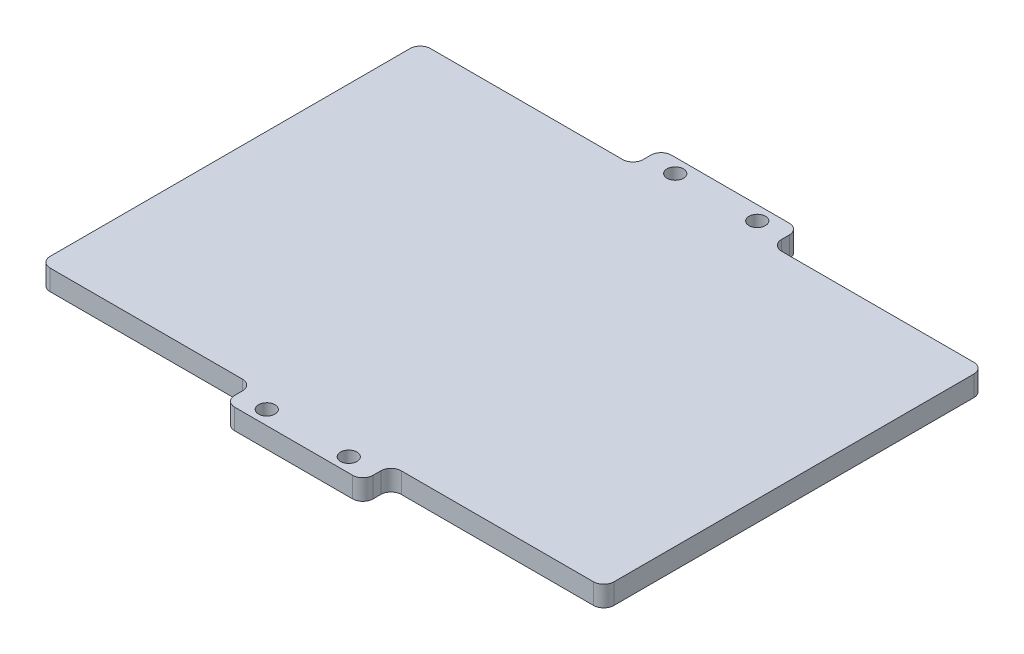
ISO-10303-21;
HEADER;
FILE_DESCRIPTION(('STEP AP214'),'2;1');
FILE_NAME('part.step','',(''),(''),'','','');
FILE_SCHEMA(('AUTOMOTIVE_DESIGN { 1 0 10303 214 1 1 1 1 }'));
ENDSEC;
DATA;
#1=APPLICATION_CONTEXT('core data for automotive mechanical design processes');
#2=APPLICATION_PROTOCOL_DEFINITION('international standard','automotive_design',2000,#1);
#3=PRODUCT_CONTEXT('',#1,'mechanical');
#4=PRODUCT('Part','Part','',(#3));
#5=PRODUCT_RELATED_PRODUCT_CATEGORY('part','',(#4));
#6=PRODUCT_DEFINITION_FORMATION('','',#4);
#7=PRODUCT_DEFINITION_CONTEXT('part definition',#1,'design');
#8=PRODUCT_DEFINITION('design','',#6,#7);
#9=PRODUCT_DEFINITION_SHAPE('','',#8);
#10=(LENGTH_UNIT() NAMED_UNIT(*) SI_UNIT(.MILLI.,.METRE.));
#11=(NAMED_UNIT(*) PLANE_ANGLE_UNIT() SI_UNIT($,.RADIAN.));
#12=(NAMED_UNIT(*) SI_UNIT($,.STERADIAN.) SOLID_ANGLE_UNIT());
#13=UNCERTAINTY_MEASURE_WITH_UNIT(LENGTH_MEASURE(1.E-05),#10,'distance_accuracy_value','');
#14=(GEOMETRIC_REPRESENTATION_CONTEXT(3) GLOBAL_UNCERTAINTY_ASSIGNED_CONTEXT((#13)) GLOBAL_UNIT_ASSIGNED_CONTEXT((#10,
#11,#12)) REPRESENTATION_CONTEXT('',''));
#15=CARTESIAN_POINT('',(0.,0.,0.));
#16=DIRECTION('',(0.,0.,1.));
#17=DIRECTION('',(1.,0.,0.));
#18=AXIS2_PLACEMENT_3D('',#15,#16,#17);
#19=CARTESIAN_POINT('',(55.,4.,42.6));
#20=DIRECTION('',(-1.,0.,0.));
#21=DIRECTION('',(0.,0.,1.));
#22=AXIS2_PLACEMENT_3D('',#19,#20,#21);
#23=PLANE('',#22);
#24=DIRECTION('',(0.,0.,-1.));
#25=VECTOR('',#24,1.);
#26=CARTESIAN_POINT('',(55.,0.,42.6));
#27=LINE('',#26,#25);
#28=CARTESIAN_POINT('',(55.,0.,35.1));
#29=VERTEX_POINT('',#28);
#30=CARTESIAN_POINT('',(55.,0.,-35.1));
#31=VERTEX_POINT('',#30);
#32=EDGE_CURVE('E390',#29,#31,#27,.T.);
#33=ORIENTED_EDGE('',*,*,#32,.T.);
#34=DIRECTION('',(0.,1.,0.));
#35=VECTOR('',#34,1.);
#36=CARTESIAN_POINT('',(55.,4.,-35.1));
#37=LINE('',#36,#35);
#38=CARTESIAN_POINT('',(55.,4.,-35.1));
#39=VERTEX_POINT('',#38);
#40=EDGE_CURVE('E313',#31,#39,#37,.T.);
#41=ORIENTED_EDGE('',*,*,#40,.T.);
#42=DIRECTION('',(0.,0.,-1.));
#43=VECTOR('',#42,1.);
#44=CARTESIAN_POINT('',(55.,4.,42.6));
#45=LINE('',#44,#43);
#46=CARTESIAN_POINT('',(55.,4.,35.1));
#47=VERTEX_POINT('',#46);
#48=EDGE_CURVE('E225',#47,#39,#45,.T.);
#49=ORIENTED_EDGE('',*,*,#48,.F.);
#50=DIRECTION('',(0.,-1.,0.));
#51=VECTOR('',#50,1.);
#52=CARTESIAN_POINT('',(55.,4.,35.1));
#53=LINE('',#52,#51);
#54=EDGE_CURVE('E310',#47,#29,#53,.T.);
#55=ORIENTED_EDGE('',*,*,#54,.T.);
#56=EDGE_LOOP('',(#33,#41,#49,#55));
#57=FACE_BOUND('',#56,.T.);
#58=ADVANCED_FACE('F34',(#57),#23,.F.);
#59=CARTESIAN_POINT('',(-55.,4.,-42.6));
#60=DIRECTION('',(0.,0.,1.));
#61=DIRECTION('',(1.,0.,0.));
#62=AXIS2_PLACEMENT_3D('',#59,#60,#61);
#63=PLANE('',#62);
#64=DIRECTION('',(-1.,0.,0.));
#65=VECTOR('',#64,1.);
#66=CARTESIAN_POINT('',(-55.,0.,-42.6));
#67=LINE('',#66,#65);
#68=CARTESIAN_POINT('',(11.5,0.,-42.6));
#69=VERTEX_POINT('',#68);
#70=CARTESIAN_POINT('',(-11.5,0.,-42.6));
#71=VERTEX_POINT('',#70);
#72=EDGE_CURVE('E232',#69,#71,#67,.T.);
#73=ORIENTED_EDGE('',*,*,#72,.T.);
#74=DIRECTION('',(0.,1.,0.));
#75=VECTOR('',#74,1.);
#76=CARTESIAN_POINT('',(-11.5,4.,-42.6));
#77=LINE('',#76,#75);
#78=CARTESIAN_POINT('',(-11.5,4.,-42.6));
#79=VERTEX_POINT('',#78);
#80=EDGE_CURVE('E298',#71,#79,#77,.T.);
#81=ORIENTED_EDGE('',*,*,#80,.T.);
#82=DIRECTION('',(-1.,0.,0.));
#83=VECTOR('',#82,1.);
#84=CARTESIAN_POINT('',(-55.,4.,-42.6));
#85=LINE('',#84,#83);
#86=CARTESIAN_POINT('',(11.5,4.,-42.6));
#87=VERTEX_POINT('',#86);
#88=EDGE_CURVE('E229',#87,#79,#85,.T.);
#89=ORIENTED_EDGE('',*,*,#88,.F.);
#90=DIRECTION('',(0.,-1.,0.));
#91=VECTOR('',#90,1.);
#92=CARTESIAN_POINT('',(11.5,4.,-42.6));
#93=LINE('',#92,#91);
#94=EDGE_CURVE('E295',#87,#69,#93,.T.);
#95=ORIENTED_EDGE('',*,*,#94,.T.);
#96=EDGE_LOOP('',(#73,#81,#89,#95));
#97=FACE_BOUND('',#96,.T.);
#98=ADVANCED_FACE('F403',(#97),#63,.F.);
#99=CARTESIAN_POINT('',(-55.,4.,42.6));
#100=DIRECTION('',(1.,0.,0.));
#101=DIRECTION('',(0.,0.,-1.));
#102=AXIS2_PLACEMENT_3D('',#99,#100,#101);
#103=PLANE('',#102);
#104=DIRECTION('',(0.,0.,1.));
#105=VECTOR('',#104,1.);
#106=CARTESIAN_POINT('',(-55.,0.,42.6));
#107=LINE('',#106,#105);
#108=CARTESIAN_POINT('',(-55.,0.,-35.1));
#109=VERTEX_POINT('',#108);
#110=CARTESIAN_POINT('',(-55.,0.,35.1));
#111=VERTEX_POINT('',#110);
#112=EDGE_CURVE('E226',#109,#111,#107,.T.);
#113=ORIENTED_EDGE('',*,*,#112,.T.);
#114=DIRECTION('',(0.,1.,0.));
#115=VECTOR('',#114,1.);
#116=CARTESIAN_POINT('',(-55.,4.,35.1));
#117=LINE('',#116,#115);
#118=CARTESIAN_POINT('',(-55.,4.,35.1));
#119=VERTEX_POINT('',#118);
#120=EDGE_CURVE('E283',#111,#119,#117,.T.);
#121=ORIENTED_EDGE('',*,*,#120,.T.);
#122=DIRECTION('',(0.,0.,1.));
#123=VECTOR('',#122,1.);
#124=CARTESIAN_POINT('',(-55.,4.,42.6));
#125=LINE('',#124,#123);
#126=CARTESIAN_POINT('',(-55.,4.,-35.1));
#127=VERTEX_POINT('',#126);
#128=EDGE_CURVE('E395',#127,#119,#125,.T.);
#129=ORIENTED_EDGE('',*,*,#128,.F.);
#130=DIRECTION('',(0.,-1.,0.));
#131=VECTOR('',#130,1.);
#132=CARTESIAN_POINT('',(-55.,4.,-35.1));
#133=LINE('',#132,#131);
#134=EDGE_CURVE('E280',#127,#109,#133,.T.);
#135=ORIENTED_EDGE('',*,*,#134,.T.);
#136=EDGE_LOOP('',(#113,#121,#129,#135));
#137=FACE_BOUND('',#136,.T.);
#138=ADVANCED_FACE('F429',(#137),#103,.F.);
#139=CARTESIAN_POINT('',(-55.,4.,42.6));
#140=DIRECTION('',(0.,0.,-1.));
#141=DIRECTION('',(-1.,0.,0.));
#142=AXIS2_PLACEMENT_3D('',#139,#140,#141);
#143=PLANE('',#142);
#144=DIRECTION('',(1.,0.,0.));
#145=VECTOR('',#144,1.);
#146=CARTESIAN_POINT('',(-55.,4.,42.6));
#147=LINE('',#146,#145);
#148=CARTESIAN_POINT('',(-11.5,4.,42.6));
#149=VERTEX_POINT('',#148);
#150=CARTESIAN_POINT('',(11.5,4.,42.6));
#151=VERTEX_POINT('',#150);
#152=EDGE_CURVE('E217',#149,#151,#147,.T.);
#153=ORIENTED_EDGE('',*,*,#152,.F.);
#154=DIRECTION('',(0.,-1.,0.));
#155=VECTOR('',#154,1.);
#156=CARTESIAN_POINT('',(-11.5,4.,42.6));
#157=LINE('',#156,#155);
#158=CARTESIAN_POINT('',(-11.5,0.,42.6));
#159=VERTEX_POINT('',#158);
#160=EDGE_CURVE('E200',#149,#159,#157,.T.);
#161=ORIENTED_EDGE('',*,*,#160,.T.);
#162=DIRECTION('',(1.,0.,0.));
#163=VECTOR('',#162,1.);
#164=CARTESIAN_POINT('',(-55.,0.,42.6));
#165=LINE('',#164,#163);
#166=CARTESIAN_POINT('',(11.5,0.,42.6));
#167=VERTEX_POINT('',#166);
#168=EDGE_CURVE('E214',#159,#167,#165,.T.);
#169=ORIENTED_EDGE('',*,*,#168,.T.);
#170=DIRECTION('',(0.,1.,0.));
#171=VECTOR('',#170,1.);
#172=CARTESIAN_POINT('',(11.5,4.,42.6));
#173=LINE('',#172,#171);
#174=EDGE_CURVE('E219',#167,#151,#173,.T.);
#175=ORIENTED_EDGE('',*,*,#174,.T.);
#176=EDGE_LOOP('',(#153,#161,#169,#175));
#177=FACE_BOUND('',#176,.T.);
#178=ADVANCED_FACE('F212',(#177),#143,.F.);
#179=CARTESIAN_POINT('',(0.,4.,0.));
#180=DIRECTION('',(0.,-1.,0.));
#181=DIRECTION('',(0.,0.,-1.));
#182=AXIS2_PLACEMENT_3D('',#179,#180,#181);
#183=PLANE('',#182);
#184=CARTESIAN_POINT('',(8.,4.,39.85));
#185=DIRECTION('',(0.,1.,0.));
#186=DIRECTION('',(0.,0.,-1.));
#187=AXIS2_PLACEMENT_3D('',#184,#185,#186);
#188=CIRCLE('',#187,1.6);
#189=CARTESIAN_POINT('',(8.,4.,38.25));
#190=VERTEX_POINT('',#189);
#191=EDGE_CURVE('E714',#190,#190,#188,.T.);
#192=ORIENTED_EDGE('',*,*,#191,.F.);
#193=EDGE_LOOP('',(#192));
#194=FACE_BOUND('',#193,.T.);
#195=CARTESIAN_POINT('',(8.,4.,-39.85));
#196=DIRECTION('',(0.,1.,0.));
#197=DIRECTION('',(0.,0.,1.));
#198=AXIS2_PLACEMENT_3D('',#195,#196,#197);
#199=CIRCLE('',#198,1.6);
#200=CARTESIAN_POINT('',(8.,4.,-38.25));
#201=VERTEX_POINT('',#200);
#202=EDGE_CURVE('E723',#201,#201,#199,.T.);
#203=ORIENTED_EDGE('',*,*,#202,.F.);
#204=EDGE_LOOP('',(#203));
#205=FACE_BOUND('',#204,.T.);
#206=CARTESIAN_POINT('',(-7.99999999999999,4.,-39.85));
#207=DIRECTION('',(0.,1.,0.));
#208=DIRECTION('',(0.,0.,-1.));
#209=AXIS2_PLACEMENT_3D('',#206,#207,#208);
#210=CIRCLE('',#209,1.6);
#211=CARTESIAN_POINT('',(-7.99999999999999,4.,-41.45));
#212=VERTEX_POINT('',#211);
#213=EDGE_CURVE('E729',#212,#212,#210,.T.);
#214=ORIENTED_EDGE('',*,*,#213,.F.);
#215=EDGE_LOOP('',(#214));
#216=FACE_BOUND('',#215,.T.);
#217=CARTESIAN_POINT('',(-7.99999999999999,4.,39.85));
#218=DIRECTION('',(0.,1.,0.));
#219=DIRECTION('',(0.,0.,1.));
#220=AXIS2_PLACEMENT_3D('',#217,#218,#219);
#221=CIRCLE('',#220,1.6);
#222=CARTESIAN_POINT('',(-7.99999999999999,4.,41.45));
#223=VERTEX_POINT('',#222);
#224=EDGE_CURVE('E367',#223,#223,#221,.T.);
#225=ORIENTED_EDGE('',*,*,#224,.F.);
#226=EDGE_LOOP('',(#225));
#227=FACE_BOUND('',#226,.T.);
#228=DIRECTION('',(0.,0.,-1.));
#229=VECTOR('',#228,1.);
#230=CARTESIAN_POINT('',(-13.5,4.,37.1));
#231=LINE('',#230,#229);
#232=CARTESIAN_POINT('',(-13.5,4.,40.6));
#233=VERTEX_POINT('',#232);
#234=CARTESIAN_POINT('',(-13.5,4.,39.1));
#235=VERTEX_POINT('',#234);
#236=EDGE_CURVE('E360',#233,#235,#231,.T.);
#237=ORIENTED_EDGE('',*,*,#236,.F.);
#238=CARTESIAN_POINT('',(-11.5,4.,40.6));
#239=DIRECTION('',(0.,-1.,0.));
#240=DIRECTION('',(0.,0.,-1.));
#241=AXIS2_PLACEMENT_3D('',#238,#239,#240);
#242=CIRCLE('',#241,2.);
#243=EDGE_CURVE('E274',#233,#149,#242,.F.);
#244=ORIENTED_EDGE('',*,*,#243,.T.);
#245=ORIENTED_EDGE('',*,*,#152,.T.);
#246=CARTESIAN_POINT('',(11.5,4.,40.6));
#247=DIRECTION('',(0.,-1.,0.));
#248=DIRECTION('',(0.,0.,-1.));
#249=AXIS2_PLACEMENT_3D('',#246,#247,#248);
#250=CIRCLE('',#249,2.);
#251=CARTESIAN_POINT('',(13.5,4.,40.6));
#252=VERTEX_POINT('',#251);
#253=EDGE_CURVE('E263',#151,#252,#250,.F.);
#254=ORIENTED_EDGE('',*,*,#253,.T.);
#255=DIRECTION('',(0.,0.,1.));
#256=VECTOR('',#255,1.);
#257=CARTESIAN_POINT('',(13.5,4.,37.1));
#258=LINE('',#257,#256);
#259=CARTESIAN_POINT('',(13.5,4.,39.1));
#260=VERTEX_POINT('',#259);
#261=EDGE_CURVE('E343',#260,#252,#258,.T.);
#262=ORIENTED_EDGE('',*,*,#261,.F.);
#263=CARTESIAN_POINT('',(15.5,4.,39.1));
#264=DIRECTION('',(0.,-1.,0.));
#265=DIRECTION('',(0.,0.,-1.));
#266=AXIS2_PLACEMENT_3D('',#263,#264,#265);
#267=CIRCLE('',#266,2.);
#268=CARTESIAN_POINT('',(15.5,4.,37.1));
#269=VERTEX_POINT('',#268);
#270=EDGE_CURVE('E42',#260,#269,#267,.T.);
#271=ORIENTED_EDGE('',*,*,#270,.T.);
#272=DIRECTION('',(-1.,0.,0.));
#273=VECTOR('',#272,1.);
#274=CARTESIAN_POINT('',(96.5,4.,37.1));
#275=LINE('',#274,#273);
#276=CARTESIAN_POINT('',(53.,4.,37.1));
#277=VERTEX_POINT('',#276);
#278=EDGE_CURVE('E340',#277,#269,#275,.T.);
#279=ORIENTED_EDGE('',*,*,#278,.F.);
#280=CARTESIAN_POINT('',(53.,4.,35.1));
#281=DIRECTION('',(0.,-1.,0.));
#282=DIRECTION('',(0.,0.,-1.));
#283=AXIS2_PLACEMENT_3D('',#280,#281,#282);
#284=CIRCLE('',#283,2.);
#285=EDGE_CURVE('E265',#277,#47,#284,.F.);
#286=ORIENTED_EDGE('',*,*,#285,.T.);
#287=ORIENTED_EDGE('',*,*,#48,.T.);
#288=CARTESIAN_POINT('',(53.,4.,-35.1));
#289=DIRECTION('',(0.,-1.,0.));
#290=DIRECTION('',(0.,0.,-1.));
#291=AXIS2_PLACEMENT_3D('',#288,#289,#290);
#292=CIRCLE('',#291,2.);
#293=CARTESIAN_POINT('',(53.,4.,-37.1));
#294=VERTEX_POINT('',#293);
#295=EDGE_CURVE('E267',#39,#294,#292,.F.);
#296=ORIENTED_EDGE('',*,*,#295,.T.);
#297=DIRECTION('',(1.,0.,0.));
#298=VECTOR('',#297,1.);
#299=CARTESIAN_POINT('',(96.5,4.,-37.1));
#300=LINE('',#299,#298);
#301=CARTESIAN_POINT('',(15.5,4.,-37.1));
#302=VERTEX_POINT('',#301);
#303=EDGE_CURVE('E372',#302,#294,#300,.T.);
#304=ORIENTED_EDGE('',*,*,#303,.F.);
#305=CARTESIAN_POINT('',(15.5,4.,-39.1));
#306=DIRECTION('',(0.,-1.,0.));
#307=DIRECTION('',(0.,0.,-1.));
#308=AXIS2_PLACEMENT_3D('',#305,#306,#307);
#309=CIRCLE('',#308,2.);
#310=CARTESIAN_POINT('',(13.5,4.,-39.1));
#311=VERTEX_POINT('',#310);
#312=EDGE_CURVE('E332',#302,#311,#309,.T.);
#313=ORIENTED_EDGE('',*,*,#312,.T.);
#314=DIRECTION('',(0.,0.,1.));
#315=VECTOR('',#314,1.);
#316=CARTESIAN_POINT('',(13.5,4.,-37.1));
#317=LINE('',#316,#315);
#318=CARTESIAN_POINT('',(13.5,4.,-40.6));
#319=VERTEX_POINT('',#318);
#320=EDGE_CURVE('E373',#319,#311,#317,.T.);
#321=ORIENTED_EDGE('',*,*,#320,.F.);
#322=CARTESIAN_POINT('',(11.5,4.,-40.6));
#323=DIRECTION('',(0.,-1.,0.));
#324=DIRECTION('',(0.,0.,-1.));
#325=AXIS2_PLACEMENT_3D('',#322,#323,#324);
#326=CIRCLE('',#325,2.);
#327=EDGE_CURVE('E269',#319,#87,#326,.F.);
#328=ORIENTED_EDGE('',*,*,#327,.T.);
#329=ORIENTED_EDGE('',*,*,#88,.T.);
#330=CARTESIAN_POINT('',(-11.5,4.,-40.6));
#331=DIRECTION('',(0.,-1.,0.));
#332=DIRECTION('',(0.,0.,-1.));
#333=AXIS2_PLACEMENT_3D('',#330,#331,#332);
#334=CIRCLE('',#333,2.);
#335=CARTESIAN_POINT('',(-13.5,4.,-40.6));
#336=VERTEX_POINT('',#335);
#337=EDGE_CURVE('E271',#79,#336,#334,.F.);
#338=ORIENTED_EDGE('',*,*,#337,.T.);
#339=DIRECTION('',(0.,0.,-1.));
#340=VECTOR('',#339,1.);
#341=CARTESIAN_POINT('',(-13.5,4.,-37.1));
#342=LINE('',#341,#340);
#343=CARTESIAN_POINT('',(-13.5,4.,-39.1));
#344=VERTEX_POINT('',#343);
#345=EDGE_CURVE('E381',#344,#336,#342,.T.);
#346=ORIENTED_EDGE('',*,*,#345,.F.);
#347=CARTESIAN_POINT('',(-15.5,4.,-39.1));
#348=DIRECTION('',(0.,-1.,0.));
#349=DIRECTION('',(0.,0.,-1.));
#350=AXIS2_PLACEMENT_3D('',#347,#348,#349);
#351=CIRCLE('',#350,2.);
#352=CARTESIAN_POINT('',(-15.5,4.,-37.1));
#353=VERTEX_POINT('',#352);
#354=EDGE_CURVE('E328',#344,#353,#351,.T.);
#355=ORIENTED_EDGE('',*,*,#354,.T.);
#356=DIRECTION('',(1.,0.,0.));
#357=VECTOR('',#356,1.);
#358=CARTESIAN_POINT('',(-96.5,4.,-37.1));
#359=LINE('',#358,#357);
#360=CARTESIAN_POINT('',(-53.,4.,-37.1));
#361=VERTEX_POINT('',#360);
#362=EDGE_CURVE('E382',#361,#353,#359,.T.);
#363=ORIENTED_EDGE('',*,*,#362,.F.);
#364=CARTESIAN_POINT('',(-53.,4.,-35.1));
#365=DIRECTION('',(0.,-1.,0.));
#366=DIRECTION('',(0.,0.,-1.));
#367=AXIS2_PLACEMENT_3D('',#364,#365,#366);
#368=CIRCLE('',#367,2.);
#369=EDGE_CURVE('E261',#361,#127,#368,.F.);
#370=ORIENTED_EDGE('',*,*,#369,.T.);
#371=ORIENTED_EDGE('',*,*,#128,.T.);
#372=CARTESIAN_POINT('',(-53.,4.,35.1));
#373=DIRECTION('',(0.,-1.,0.));
#374=DIRECTION('',(0.,0.,-1.));
#375=AXIS2_PLACEMENT_3D('',#372,#373,#374);
#376=CIRCLE('',#375,2.);
#377=CARTESIAN_POINT('',(-53.,4.,37.1));
#378=VERTEX_POINT('',#377);
#379=EDGE_CURVE('E49',#119,#378,#376,.F.);
#380=ORIENTED_EDGE('',*,*,#379,.T.);
#381=DIRECTION('',(-1.,0.,0.));
#382=VECTOR('',#381,1.);
#383=CARTESIAN_POINT('',(-96.5,4.,37.1));
#384=LINE('',#383,#382);
#385=CARTESIAN_POINT('',(-15.5,4.,37.1));
#386=VERTEX_POINT('',#385);
#387=EDGE_CURVE('E363',#386,#378,#384,.T.);
#388=ORIENTED_EDGE('',*,*,#387,.F.);
#389=CARTESIAN_POINT('',(-15.5,4.,39.1));
#390=DIRECTION('',(0.,-1.,0.));
#391=DIRECTION('',(0.,0.,-1.));
#392=AXIS2_PLACEMENT_3D('',#389,#390,#391);
#393=CIRCLE('',#392,2.);
#394=EDGE_CURVE('E57',#386,#235,#393,.T.);
#395=ORIENTED_EDGE('',*,*,#394,.T.);
#396=EDGE_LOOP('',(#237,#244,#245,#254,#262,#271,#279,#286,#287,#296,#304,#313,#321,#328,#329,
#338,#346,#355,#363,#370,#371,#380,#388,#395));
#397=FACE_BOUND('',#396,.T.);
#398=ADVANCED_FACE('F339',(#194,#205,#216,#227,#397),#183,.F.);
#399=CARTESIAN_POINT('',(0.,0.,0.));
#400=DIRECTION('',(0.,-1.,0.));
#401=DIRECTION('',(0.,0.,-1.));
#402=AXIS2_PLACEMENT_3D('',#399,#400,#401);
#403=PLANE('',#402);
#404=CARTESIAN_POINT('',(8.,0.,39.85));
#405=DIRECTION('',(0.,1.,0.));
#406=DIRECTION('',(0.,0.,-1.));
#407=AXIS2_PLACEMENT_3D('',#404,#405,#406);
#408=CIRCLE('',#407,1.6);
#409=CARTESIAN_POINT('',(8.,0.,38.25));
#410=VERTEX_POINT('',#409);
#411=EDGE_CURVE('E712',#410,#410,#408,.T.);
#412=ORIENTED_EDGE('',*,*,#411,.T.);
#413=EDGE_LOOP('',(#412));
#414=FACE_BOUND('',#413,.T.);
#415=CARTESIAN_POINT('',(8.,0.,-39.85));
#416=DIRECTION('',(0.,1.,0.));
#417=DIRECTION('',(0.,0.,1.));
#418=AXIS2_PLACEMENT_3D('',#415,#416,#417);
#419=CIRCLE('',#418,1.6);
#420=CARTESIAN_POINT('',(8.,0.,-38.25));
#421=VERTEX_POINT('',#420);
#422=EDGE_CURVE('E718',#421,#421,#419,.T.);
#423=ORIENTED_EDGE('',*,*,#422,.T.);
#424=EDGE_LOOP('',(#423));
#425=FACE_BOUND('',#424,.T.);
#426=CARTESIAN_POINT('',(-7.99999999999999,0.,-39.85));
#427=DIRECTION('',(0.,1.,0.));
#428=DIRECTION('',(0.,0.,-1.));
#429=AXIS2_PLACEMENT_3D('',#426,#427,#428);
#430=CIRCLE('',#429,1.6);
#431=CARTESIAN_POINT('',(-7.99999999999999,0.,-41.45));
#432=VERTEX_POINT('',#431);
#433=EDGE_CURVE('E726',#432,#432,#430,.T.);
#434=ORIENTED_EDGE('',*,*,#433,.T.);
#435=EDGE_LOOP('',(#434));
#436=FACE_BOUND('',#435,.T.);
#437=CARTESIAN_POINT('',(-7.99999999999999,0.,39.85));
#438=DIRECTION('',(0.,1.,0.));
#439=DIRECTION('',(0.,0.,1.));
#440=AXIS2_PLACEMENT_3D('',#437,#438,#439);
#441=CIRCLE('',#440,1.6);
#442=CARTESIAN_POINT('',(-7.99999999999999,0.,41.45));
#443=VERTEX_POINT('',#442);
#444=EDGE_CURVE('E385',#443,#443,#441,.T.);
#445=ORIENTED_EDGE('',*,*,#444,.T.);
#446=EDGE_LOOP('',(#445));
#447=FACE_BOUND('',#446,.T.);
#448=ORIENTED_EDGE('',*,*,#168,.F.);
#449=CARTESIAN_POINT('',(-11.5,0.,40.6));
#450=DIRECTION('',(0.,-1.,0.));
#451=DIRECTION('',(0.,0.,-1.));
#452=AXIS2_PLACEMENT_3D('',#449,#450,#451);
#453=CIRCLE('',#452,2.);
#454=CARTESIAN_POINT('',(-13.5,0.,40.6));
#455=VERTEX_POINT('',#454);
#456=EDGE_CURVE('E196',#159,#455,#453,.T.);
#457=ORIENTED_EDGE('',*,*,#456,.T.);
#458=DIRECTION('',(0.,0.,1.));
#459=VECTOR('',#458,1.);
#460=CARTESIAN_POINT('',(-13.5,0.,0.));
#461=LINE('',#460,#459);
#462=CARTESIAN_POINT('',(-13.5,0.,39.1));
#463=VERTEX_POINT('',#462);
#464=EDGE_CURVE('E236',#463,#455,#461,.T.);
#465=ORIENTED_EDGE('',*,*,#464,.F.);
#466=CARTESIAN_POINT('',(-15.5,0.,39.1));
#467=DIRECTION('',(0.,-1.,0.));
#468=DIRECTION('',(0.,0.,-1.));
#469=AXIS2_PLACEMENT_3D('',#466,#467,#468);
#470=CIRCLE('',#469,2.);
#471=CARTESIAN_POINT('',(-15.5,0.,37.1));
#472=VERTEX_POINT('',#471);
#473=EDGE_CURVE('E326',#463,#472,#470,.F.);
#474=ORIENTED_EDGE('',*,*,#473,.T.);
#475=DIRECTION('',(-1.,0.,0.));
#476=VECTOR('',#475,1.);
#477=CARTESIAN_POINT('',(-96.5,0.,37.1));
#478=LINE('',#477,#476);
#479=CARTESIAN_POINT('',(-53.,0.,37.1));
#480=VERTEX_POINT('',#479);
#481=EDGE_CURVE('E388',#472,#480,#478,.T.);
#482=ORIENTED_EDGE('',*,*,#481,.T.);
#483=CARTESIAN_POINT('',(-53.,0.,35.1));
#484=DIRECTION('',(0.,-1.,0.));
#485=DIRECTION('',(0.,0.,-1.));
#486=AXIS2_PLACEMENT_3D('',#483,#484,#485);
#487=CIRCLE('',#486,2.);
#488=EDGE_CURVE('E207',#480,#111,#487,.T.);
#489=ORIENTED_EDGE('',*,*,#488,.T.);
#490=ORIENTED_EDGE('',*,*,#112,.F.);
#491=CARTESIAN_POINT('',(-53.,0.,-35.1));
#492=DIRECTION('',(0.,-1.,0.));
#493=DIRECTION('',(0.,0.,-1.));
#494=AXIS2_PLACEMENT_3D('',#491,#492,#493);
#495=CIRCLE('',#494,2.);
#496=CARTESIAN_POINT('',(-53.,0.,-37.1));
#497=VERTEX_POINT('',#496);
#498=EDGE_CURVE('E218',#109,#497,#495,.T.);
#499=ORIENTED_EDGE('',*,*,#498,.T.);
#500=DIRECTION('',(-1.,0.,0.));
#501=VECTOR('',#500,1.);
#502=CARTESIAN_POINT('',(0.,0.,-37.1));
#503=LINE('',#502,#501);
#504=CARTESIAN_POINT('',(-15.5,0.,-37.1));
#505=VERTEX_POINT('',#504);
#506=EDGE_CURVE('E238',#505,#497,#503,.T.);
#507=ORIENTED_EDGE('',*,*,#506,.F.);
#508=CARTESIAN_POINT('',(-15.5,0.,-39.1));
#509=DIRECTION('',(0.,-1.,0.));
#510=DIRECTION('',(0.,0.,-1.));
#511=AXIS2_PLACEMENT_3D('',#508,#509,#510);
#512=CIRCLE('',#511,2.);
#513=CARTESIAN_POINT('',(-13.5,0.,-39.1));
#514=VERTEX_POINT('',#513);
#515=EDGE_CURVE('E330',#505,#514,#512,.F.);
#516=ORIENTED_EDGE('',*,*,#515,.T.);
#517=DIRECTION('',(0.,0.,-1.));
#518=VECTOR('',#517,1.);
#519=CARTESIAN_POINT('',(-13.5,0.,-37.1));
#520=LINE('',#519,#518);
#521=CARTESIAN_POINT('',(-13.5,0.,-40.6));
#522=VERTEX_POINT('',#521);
#523=EDGE_CURVE('E376',#514,#522,#520,.T.);
#524=ORIENTED_EDGE('',*,*,#523,.T.);
#525=CARTESIAN_POINT('',(-11.5,0.,-40.6));
#526=DIRECTION('',(0.,-1.,0.));
#527=DIRECTION('',(0.,0.,-1.));
#528=AXIS2_PLACEMENT_3D('',#525,#526,#527);
#529=CIRCLE('',#528,2.);
#530=EDGE_CURVE('E256',#522,#71,#529,.T.);
#531=ORIENTED_EDGE('',*,*,#530,.T.);
#532=ORIENTED_EDGE('',*,*,#72,.F.);
#533=CARTESIAN_POINT('',(11.5,0.,-40.6));
#534=DIRECTION('',(0.,-1.,0.));
#535=DIRECTION('',(0.,0.,-1.));
#536=AXIS2_PLACEMENT_3D('',#533,#534,#535);
#537=CIRCLE('',#536,2.);
#538=CARTESIAN_POINT('',(13.5,0.,-40.6));
#539=VERTEX_POINT('',#538);
#540=EDGE_CURVE('E254',#69,#539,#537,.T.);
#541=ORIENTED_EDGE('',*,*,#540,.T.);
#542=DIRECTION('',(0.,0.,-1.));
#543=VECTOR('',#542,1.);
#544=CARTESIAN_POINT('',(13.5,0.,0.));
#545=LINE('',#544,#543);
#546=CARTESIAN_POINT('',(13.5,0.,-39.1));
#547=VERTEX_POINT('',#546);
#548=EDGE_CURVE('E241',#547,#539,#545,.T.);
#549=ORIENTED_EDGE('',*,*,#548,.F.);
#550=CARTESIAN_POINT('',(15.5,0.,-39.1));
#551=DIRECTION('',(0.,-1.,0.));
#552=DIRECTION('',(0.,0.,-1.));
#553=AXIS2_PLACEMENT_3D('',#550,#551,#552);
#554=CIRCLE('',#553,2.);
#555=CARTESIAN_POINT('',(15.5,0.,-37.1));
#556=VERTEX_POINT('',#555);
#557=EDGE_CURVE('E334',#547,#556,#554,.F.);
#558=ORIENTED_EDGE('',*,*,#557,.T.);
#559=DIRECTION('',(1.,0.,0.));
#560=VECTOR('',#559,1.);
#561=CARTESIAN_POINT('',(96.5,0.,-37.1));
#562=LINE('',#561,#560);
#563=CARTESIAN_POINT('',(53.,0.,-37.1));
#564=VERTEX_POINT('',#563);
#565=EDGE_CURVE('E351',#556,#564,#562,.T.);
#566=ORIENTED_EDGE('',*,*,#565,.T.);
#567=CARTESIAN_POINT('',(53.,0.,-35.1));
#568=DIRECTION('',(0.,-1.,0.));
#569=DIRECTION('',(0.,0.,-1.));
#570=AXIS2_PLACEMENT_3D('',#567,#568,#569);
#571=CIRCLE('',#570,2.);
#572=EDGE_CURVE('E252',#564,#31,#571,.T.);
#573=ORIENTED_EDGE('',*,*,#572,.T.);
#574=ORIENTED_EDGE('',*,*,#32,.F.);
#575=CARTESIAN_POINT('',(53.,0.,35.1));
#576=DIRECTION('',(0.,-1.,0.));
#577=DIRECTION('',(0.,0.,-1.));
#578=AXIS2_PLACEMENT_3D('',#575,#576,#577);
#579=CIRCLE('',#578,2.);
#580=CARTESIAN_POINT('',(53.,0.,37.1));
#581=VERTEX_POINT('',#580);
#582=EDGE_CURVE('E250',#29,#581,#579,.T.);
#583=ORIENTED_EDGE('',*,*,#582,.T.);
#584=DIRECTION('',(1.,0.,0.));
#585=VECTOR('',#584,1.);
#586=CARTESIAN_POINT('',(0.,0.,37.1));
#587=LINE('',#586,#585);
#588=CARTESIAN_POINT('',(15.5,0.,37.1));
#589=VERTEX_POINT('',#588);
#590=EDGE_CURVE('E244',#589,#581,#587,.T.);
#591=ORIENTED_EDGE('',*,*,#590,.F.);
#592=CARTESIAN_POINT('',(15.5,0.,39.1));
#593=DIRECTION('',(0.,-1.,0.));
#594=DIRECTION('',(0.,0.,-1.));
#595=AXIS2_PLACEMENT_3D('',#592,#593,#594);
#596=CIRCLE('',#595,2.);
#597=CARTESIAN_POINT('',(13.5,0.,39.1));
#598=VERTEX_POINT('',#597);
#599=EDGE_CURVE('E11',#589,#598,#596,.F.);
#600=ORIENTED_EDGE('',*,*,#599,.T.);
#601=DIRECTION('',(0.,0.,1.));
#602=VECTOR('',#601,1.);
#603=CARTESIAN_POINT('',(13.5,0.,37.1));
#604=LINE('',#603,#602);
#605=CARTESIAN_POINT('',(13.5,0.,40.6));
#606=VERTEX_POINT('',#605);
#607=EDGE_CURVE('E356',#598,#606,#604,.T.);
#608=ORIENTED_EDGE('',*,*,#607,.T.);
#609=CARTESIAN_POINT('',(11.5,0.,40.6));
#610=DIRECTION('',(0.,-1.,0.));
#611=DIRECTION('',(0.,0.,-1.));
#612=AXIS2_PLACEMENT_3D('',#609,#610,#611);
#613=CIRCLE('',#612,2.);
#614=EDGE_CURVE('E224',#606,#167,#613,.T.);
#615=ORIENTED_EDGE('',*,*,#614,.T.);
#616=EDGE_LOOP('',(#448,#457,#465,#474,#482,#489,#490,#499,#507,#516,#524,#531,#532,#541,#549,
#558,#566,#573,#574,#583,#591,#600,#608,#615));
#617=FACE_BOUND('',#616,.T.);
#618=ADVANCED_FACE('F221',(#414,#425,#436,#447,#617),#403,.T.);
#619=CARTESIAN_POINT('',(-13.5,0.,37.1));
#620=DIRECTION('',(1.,0.,0.));
#621=DIRECTION('',(0.,0.,-1.));
#622=AXIS2_PLACEMENT_3D('',#619,#620,#621);
#623=PLANE('',#622);
#624=ORIENTED_EDGE('',*,*,#464,.T.);
#625=DIRECTION('',(0.,-1.,0.));
#626=VECTOR('',#625,1.);
#627=CARTESIAN_POINT('',(-13.5,0.,40.6));
#628=LINE('',#627,#626);
#629=EDGE_CURVE('E201',#455,#233,#628,.F.);
#630=ORIENTED_EDGE('',*,*,#629,.T.);
#631=ORIENTED_EDGE('',*,*,#236,.T.);
#632=DIRECTION('',(0.,1.,0.));
#633=VECTOR('',#632,1.);
#634=CARTESIAN_POINT('',(-13.5,0.,39.1));
#635=LINE('',#634,#633);
#636=EDGE_CURVE('E206',#235,#463,#635,.F.);
#637=ORIENTED_EDGE('',*,*,#636,.T.);
#638=EDGE_LOOP('',(#624,#630,#631,#637));
#639=FACE_BOUND('',#638,.T.);
#640=ADVANCED_FACE('F442',(#639),#623,.F.);
#641=CARTESIAN_POINT('',(-96.5,0.,37.1));
#642=DIRECTION('',(0.,0.,-1.));
#643=DIRECTION('',(-1.,0.,0.));
#644=AXIS2_PLACEMENT_3D('',#641,#642,#643);
#645=PLANE('',#644);
#646=ORIENTED_EDGE('',*,*,#481,.F.);
#647=DIRECTION('',(0.,1.,0.));
#648=VECTOR('',#647,1.);
#649=CARTESIAN_POINT('',(-15.5,4.,37.1));
#650=LINE('',#649,#648);
#651=EDGE_CURVE('E278',#472,#386,#650,.T.);
#652=ORIENTED_EDGE('',*,*,#651,.T.);
#653=ORIENTED_EDGE('',*,*,#387,.T.);
#654=DIRECTION('',(0.,1.,0.));
#655=VECTOR('',#654,1.);
#656=CARTESIAN_POINT('',(-53.,0.,37.1));
#657=LINE('',#656,#655);
#658=EDGE_CURVE('E276',#378,#480,#657,.F.);
#659=ORIENTED_EDGE('',*,*,#658,.T.);
#660=EDGE_LOOP('',(#646,#652,#653,#659));
#661=FACE_BOUND('',#660,.T.);
#662=ADVANCED_FACE('F438',(#661),#645,.F.);
#663=CARTESIAN_POINT('',(-13.5,0.,-37.1));
#664=DIRECTION('',(1.,0.,0.));
#665=DIRECTION('',(0.,0.,-1.));
#666=AXIS2_PLACEMENT_3D('',#663,#664,#665);
#667=PLANE('',#666);
#668=ORIENTED_EDGE('',*,*,#523,.F.);
#669=DIRECTION('',(0.,1.,0.));
#670=VECTOR('',#669,1.);
#671=CARTESIAN_POINT('',(-13.5,4.,-39.1));
#672=LINE('',#671,#670);
#673=EDGE_CURVE('E288',#514,#344,#672,.T.);
#674=ORIENTED_EDGE('',*,*,#673,.T.);
#675=ORIENTED_EDGE('',*,*,#345,.T.);
#676=DIRECTION('',(0.,1.,0.));
#677=VECTOR('',#676,1.);
#678=CARTESIAN_POINT('',(-13.5,0.,-40.6));
#679=LINE('',#678,#677);
#680=EDGE_CURVE('E286',#336,#522,#679,.F.);
#681=ORIENTED_EDGE('',*,*,#680,.T.);
#682=EDGE_LOOP('',(#668,#674,#675,#681));
#683=FACE_BOUND('',#682,.T.);
#684=ADVANCED_FACE('F413',(#683),#667,.F.);
#685=CARTESIAN_POINT('',(-96.5,0.,-37.1));
#686=DIRECTION('',(0.,0.,1.));
#687=DIRECTION('',(1.,0.,0.));
#688=AXIS2_PLACEMENT_3D('',#685,#686,#687);
#689=PLANE('',#688);
#690=ORIENTED_EDGE('',*,*,#362,.T.);
#691=DIRECTION('',(0.,1.,0.));
#692=VECTOR('',#691,1.);
#693=CARTESIAN_POINT('',(-15.5,0.,-37.1));
#694=LINE('',#693,#692);
#695=EDGE_CURVE('E293',#353,#505,#694,.F.);
#696=ORIENTED_EDGE('',*,*,#695,.T.);
#697=ORIENTED_EDGE('',*,*,#506,.T.);
#698=DIRECTION('',(0.,-1.,0.));
#699=VECTOR('',#698,1.);
#700=CARTESIAN_POINT('',(-53.,0.,-37.1));
#701=LINE('',#700,#699);
#702=EDGE_CURVE('E291',#497,#361,#701,.F.);
#703=ORIENTED_EDGE('',*,*,#702,.T.);
#704=EDGE_LOOP('',(#690,#696,#697,#703));
#705=FACE_BOUND('',#704,.T.);
#706=ADVANCED_FACE('F422',(#705),#689,.F.);
#707=CARTESIAN_POINT('',(96.5,0.,-37.1));
#708=DIRECTION('',(0.,0.,1.));
#709=DIRECTION('',(1.,0.,0.));
#710=AXIS2_PLACEMENT_3D('',#707,#708,#709);
#711=PLANE('',#710);
#712=ORIENTED_EDGE('',*,*,#565,.F.);
#713=DIRECTION('',(0.,1.,0.));
#714=VECTOR('',#713,1.);
#715=CARTESIAN_POINT('',(15.5,4.,-37.1));
#716=LINE('',#715,#714);
#717=EDGE_CURVE('E307',#556,#302,#716,.T.);
#718=ORIENTED_EDGE('',*,*,#717,.T.);
#719=ORIENTED_EDGE('',*,*,#303,.T.);
#720=DIRECTION('',(0.,1.,0.));
#721=VECTOR('',#720,1.);
#722=CARTESIAN_POINT('',(53.,0.,-37.1));
#723=LINE('',#722,#721);
#724=EDGE_CURVE('E305',#294,#564,#723,.F.);
#725=ORIENTED_EDGE('',*,*,#724,.T.);
#726=EDGE_LOOP('',(#712,#718,#719,#725));
#727=FACE_BOUND('',#726,.T.);
#728=ADVANCED_FACE('F593',(#727),#711,.F.);
#729=CARTESIAN_POINT('',(13.5,0.,-37.1));
#730=DIRECTION('',(-1.,0.,0.));
#731=DIRECTION('',(0.,0.,1.));
#732=AXIS2_PLACEMENT_3D('',#729,#730,#731);
#733=PLANE('',#732);
#734=ORIENTED_EDGE('',*,*,#548,.T.);
#735=DIRECTION('',(0.,-1.,0.));
#736=VECTOR('',#735,1.);
#737=CARTESIAN_POINT('',(13.5,0.,-40.6));
#738=LINE('',#737,#736);
#739=EDGE_CURVE('E303',#539,#319,#738,.F.);
#740=ORIENTED_EDGE('',*,*,#739,.T.);
#741=ORIENTED_EDGE('',*,*,#320,.T.);
#742=DIRECTION('',(0.,1.,0.));
#743=VECTOR('',#742,1.);
#744=CARTESIAN_POINT('',(13.5,0.,-39.1));
#745=LINE('',#744,#743);
#746=EDGE_CURVE('E301',#311,#547,#745,.F.);
#747=ORIENTED_EDGE('',*,*,#746,.T.);
#748=EDGE_LOOP('',(#734,#740,#741,#747));
#749=FACE_BOUND('',#748,.T.);
#750=ADVANCED_FACE('F584',(#749),#733,.F.);
#751=CARTESIAN_POINT('',(13.5,0.,37.1));
#752=DIRECTION('',(-1.,0.,0.));
#753=DIRECTION('',(0.,0.,1.));
#754=AXIS2_PLACEMENT_3D('',#751,#752,#753);
#755=PLANE('',#754);
#756=ORIENTED_EDGE('',*,*,#607,.F.);
#757=DIRECTION('',(0.,1.,0.));
#758=VECTOR('',#757,1.);
#759=CARTESIAN_POINT('',(13.5,4.,39.1));
#760=LINE('',#759,#758);
#761=EDGE_CURVE('E322',#598,#260,#760,.T.);
#762=ORIENTED_EDGE('',*,*,#761,.T.);
#763=ORIENTED_EDGE('',*,*,#261,.T.);
#764=DIRECTION('',(0.,1.,0.));
#765=VECTOR('',#764,1.);
#766=CARTESIAN_POINT('',(13.5,0.,40.6));
#767=LINE('',#766,#765);
#768=EDGE_CURVE('E320',#252,#606,#767,.F.);
#769=ORIENTED_EDGE('',*,*,#768,.T.);
#770=EDGE_LOOP('',(#756,#762,#763,#769));
#771=FACE_BOUND('',#770,.T.);
#772=ADVANCED_FACE('F358',(#771),#755,.F.);
#773=CARTESIAN_POINT('',(96.5,0.,37.1));
#774=DIRECTION('',(0.,0.,-1.));
#775=DIRECTION('',(-1.,0.,0.));
#776=AXIS2_PLACEMENT_3D('',#773,#774,#775);
#777=PLANE('',#776);
#778=ORIENTED_EDGE('',*,*,#590,.T.);
#779=DIRECTION('',(0.,-1.,0.));
#780=VECTOR('',#779,1.);
#781=CARTESIAN_POINT('',(53.,0.,37.1));
#782=LINE('',#781,#780);
#783=EDGE_CURVE('E318',#581,#277,#782,.F.);
#784=ORIENTED_EDGE('',*,*,#783,.T.);
#785=ORIENTED_EDGE('',*,*,#278,.T.);
#786=DIRECTION('',(0.,1.,0.));
#787=VECTOR('',#786,1.);
#788=CARTESIAN_POINT('',(15.5,0.,37.1));
#789=LINE('',#788,#787);
#790=EDGE_CURVE('E316',#269,#589,#789,.F.);
#791=ORIENTED_EDGE('',*,*,#790,.T.);
#792=EDGE_LOOP('',(#778,#784,#785,#791));
#793=FACE_BOUND('',#792,.T.);
#794=ADVANCED_FACE('F348',(#793),#777,.F.);
#795=CARTESIAN_POINT('',(-7.99999999999999,0.,39.85));
#796=DIRECTION('',(0.,1.,0.));
#797=DIRECTION('',(0.,0.,1.));
#798=AXIS2_PLACEMENT_3D('',#795,#796,#797);
#799=CYLINDRICAL_SURFACE('',#798,1.6);
#800=ORIENTED_EDGE('',*,*,#444,.F.);
#801=EDGE_LOOP('',(#800));
#802=FACE_BOUND('',#801,.T.);
#803=ORIENTED_EDGE('',*,*,#224,.T.);
#804=EDGE_LOOP('',(#803));
#805=FACE_BOUND('',#804,.T.);
#806=ADVANCED_FACE('F573',(#802,#805),#799,.F.);
#807=CARTESIAN_POINT('',(-7.99999999999999,0.,-39.85));
#808=DIRECTION('',(0.,1.,0.));
#809=DIRECTION('',(0.,0.,1.));
#810=AXIS2_PLACEMENT_3D('',#807,#808,#809);
#811=CYLINDRICAL_SURFACE('',#810,1.6);
#812=ORIENTED_EDGE('',*,*,#433,.F.);
#813=EDGE_LOOP('',(#812));
#814=FACE_BOUND('',#813,.T.);
#815=ORIENTED_EDGE('',*,*,#213,.T.);
#816=EDGE_LOOP('',(#815));
#817=FACE_BOUND('',#816,.T.);
#818=ADVANCED_FACE('F685',(#814,#817),#811,.F.);
#819=CARTESIAN_POINT('',(8.,0.,-39.85));
#820=DIRECTION('',(0.,1.,0.));
#821=DIRECTION('',(0.,0.,1.));
#822=AXIS2_PLACEMENT_3D('',#819,#820,#821);
#823=CYLINDRICAL_SURFACE('',#822,1.6);
#824=ORIENTED_EDGE('',*,*,#422,.F.);
#825=EDGE_LOOP('',(#824));
#826=FACE_BOUND('',#825,.T.);
#827=ORIENTED_EDGE('',*,*,#202,.T.);
#828=EDGE_LOOP('',(#827));
#829=FACE_BOUND('',#828,.T.);
#830=ADVANCED_FACE('F675',(#826,#829),#823,.F.);
#831=CARTESIAN_POINT('',(8.,0.,39.85));
#832=DIRECTION('',(0.,1.,0.));
#833=DIRECTION('',(0.,0.,1.));
#834=AXIS2_PLACEMENT_3D('',#831,#832,#833);
#835=CYLINDRICAL_SURFACE('',#834,1.6);
#836=ORIENTED_EDGE('',*,*,#411,.F.);
#837=EDGE_LOOP('',(#836));
#838=FACE_BOUND('',#837,.T.);
#839=ORIENTED_EDGE('',*,*,#191,.T.);
#840=EDGE_LOOP('',(#839));
#841=FACE_BOUND('',#840,.T.);
#842=ADVANCED_FACE('F464',(#838,#841),#835,.F.);
#843=CARTESIAN_POINT('',(-11.5,4.,40.6));
#844=DIRECTION('',(0.,-1.,0.));
#845=DIRECTION('',(0.,0.,-1.));
#846=AXIS2_PLACEMENT_3D('',#843,#844,#845);
#847=CYLINDRICAL_SURFACE('',#846,2.);
#848=ORIENTED_EDGE('',*,*,#243,.F.);
#849=ORIENTED_EDGE('',*,*,#629,.F.);
#850=ORIENTED_EDGE('',*,*,#456,.F.);
#851=ORIENTED_EDGE('',*,*,#160,.F.);
#852=EDGE_LOOP('',(#848,#849,#850,#851));
#853=FACE_BOUND('',#852,.T.);
#854=ADVANCED_FACE('F199',(#853),#847,.T.);
#855=CARTESIAN_POINT('',(-15.5,0.,39.1));
#856=DIRECTION('',(0.,-1.,0.));
#857=DIRECTION('',(0.,0.,-1.));
#858=AXIS2_PLACEMENT_3D('',#855,#856,#857);
#859=CYLINDRICAL_SURFACE('',#858,2.);
#860=ORIENTED_EDGE('',*,*,#473,.F.);
#861=ORIENTED_EDGE('',*,*,#636,.F.);
#862=ORIENTED_EDGE('',*,*,#394,.F.);
#863=ORIENTED_EDGE('',*,*,#651,.F.);
#864=EDGE_LOOP('',(#860,#861,#862,#863));
#865=FACE_BOUND('',#864,.T.);
#866=ADVANCED_FACE('F440',(#865),#859,.F.);
#867=CARTESIAN_POINT('',(-53.,4.,35.1));
#868=DIRECTION('',(0.,1.,0.));
#869=DIRECTION('',(0.,0.,1.));
#870=AXIS2_PLACEMENT_3D('',#867,#868,#869);
#871=CYLINDRICAL_SURFACE('',#870,2.);
#872=ORIENTED_EDGE('',*,*,#488,.F.);
#873=ORIENTED_EDGE('',*,*,#658,.F.);
#874=ORIENTED_EDGE('',*,*,#379,.F.);
#875=ORIENTED_EDGE('',*,*,#120,.F.);
#876=EDGE_LOOP('',(#872,#873,#874,#875));
#877=FACE_BOUND('',#876,.T.);
#878=ADVANCED_FACE('F434',(#877),#871,.T.);
#879=CARTESIAN_POINT('',(-15.5,0.,-39.1));
#880=DIRECTION('',(0.,-1.,0.));
#881=DIRECTION('',(0.,0.,-1.));
#882=AXIS2_PLACEMENT_3D('',#879,#880,#881);
#883=CYLINDRICAL_SURFACE('',#882,2.);
#884=ORIENTED_EDGE('',*,*,#515,.F.);
#885=ORIENTED_EDGE('',*,*,#695,.F.);
#886=ORIENTED_EDGE('',*,*,#354,.F.);
#887=ORIENTED_EDGE('',*,*,#673,.F.);
#888=EDGE_LOOP('',(#884,#885,#886,#887));
#889=FACE_BOUND('',#888,.T.);
#890=ADVANCED_FACE('F417',(#889),#883,.F.);
#891=CARTESIAN_POINT('',(-11.5,4.,-40.6));
#892=DIRECTION('',(0.,1.,0.));
#893=DIRECTION('',(0.,0.,1.));
#894=AXIS2_PLACEMENT_3D('',#891,#892,#893);
#895=CYLINDRICAL_SURFACE('',#894,2.);
#896=ORIENTED_EDGE('',*,*,#530,.F.);
#897=ORIENTED_EDGE('',*,*,#680,.F.);
#898=ORIENTED_EDGE('',*,*,#337,.F.);
#899=ORIENTED_EDGE('',*,*,#80,.F.);
#900=EDGE_LOOP('',(#896,#897,#898,#899));
#901=FACE_BOUND('',#900,.T.);
#902=ADVANCED_FACE('F408',(#901),#895,.T.);
#903=CARTESIAN_POINT('',(11.5,4.,-40.6));
#904=DIRECTION('',(0.,-1.,0.));
#905=DIRECTION('',(0.,0.,-1.));
#906=AXIS2_PLACEMENT_3D('',#903,#904,#905);
#907=CYLINDRICAL_SURFACE('',#906,2.);
#908=ORIENTED_EDGE('',*,*,#327,.F.);
#909=ORIENTED_EDGE('',*,*,#739,.F.);
#910=ORIENTED_EDGE('',*,*,#540,.F.);
#911=ORIENTED_EDGE('',*,*,#94,.F.);
#912=EDGE_LOOP('',(#908,#909,#910,#911));
#913=FACE_BOUND('',#912,.T.);
#914=ADVANCED_FACE('F473',(#913),#907,.T.);
#915=CARTESIAN_POINT('',(15.5,0.,-39.1));
#916=DIRECTION('',(0.,-1.,0.));
#917=DIRECTION('',(0.,0.,-1.));
#918=AXIS2_PLACEMENT_3D('',#915,#916,#917);
#919=CYLINDRICAL_SURFACE('',#918,2.);
#920=ORIENTED_EDGE('',*,*,#557,.F.);
#921=ORIENTED_EDGE('',*,*,#746,.F.);
#922=ORIENTED_EDGE('',*,*,#312,.F.);
#923=ORIENTED_EDGE('',*,*,#717,.F.);
#924=EDGE_LOOP('',(#920,#921,#922,#923));
#925=FACE_BOUND('',#924,.T.);
#926=ADVANCED_FACE('F476',(#925),#919,.F.);
#927=CARTESIAN_POINT('',(53.,4.,-35.1));
#928=DIRECTION('',(0.,1.,0.));
#929=DIRECTION('',(0.,0.,1.));
#930=AXIS2_PLACEMENT_3D('',#927,#928,#929);
#931=CYLINDRICAL_SURFACE('',#930,2.);
#932=ORIENTED_EDGE('',*,*,#572,.F.);
#933=ORIENTED_EDGE('',*,*,#724,.F.);
#934=ORIENTED_EDGE('',*,*,#295,.F.);
#935=ORIENTED_EDGE('',*,*,#40,.F.);
#936=EDGE_LOOP('',(#932,#933,#934,#935));
#937=FACE_BOUND('',#936,.T.);
#938=ADVANCED_FACE('F480',(#937),#931,.T.);
#939=CARTESIAN_POINT('',(53.,4.,35.1));
#940=DIRECTION('',(0.,-1.,0.));
#941=DIRECTION('',(0.,0.,-1.));
#942=AXIS2_PLACEMENT_3D('',#939,#940,#941);
#943=CYLINDRICAL_SURFACE('',#942,2.);
#944=ORIENTED_EDGE('',*,*,#285,.F.);
#945=ORIENTED_EDGE('',*,*,#783,.F.);
#946=ORIENTED_EDGE('',*,*,#582,.F.);
#947=ORIENTED_EDGE('',*,*,#54,.F.);
#948=EDGE_LOOP('',(#944,#945,#946,#947));
#949=FACE_BOUND('',#948,.T.);
#950=ADVANCED_FACE('F484',(#949),#943,.T.);
#951=CARTESIAN_POINT('',(15.5,0.,39.1));
#952=DIRECTION('',(0.,-1.,0.));
#953=DIRECTION('',(0.,0.,-1.));
#954=AXIS2_PLACEMENT_3D('',#951,#952,#953);
#955=CYLINDRICAL_SURFACE('',#954,2.);
#956=ORIENTED_EDGE('',*,*,#599,.F.);
#957=ORIENTED_EDGE('',*,*,#790,.F.);
#958=ORIENTED_EDGE('',*,*,#270,.F.);
#959=ORIENTED_EDGE('',*,*,#761,.F.);
#960=EDGE_LOOP('',(#956,#957,#958,#959));
#961=FACE_BOUND('',#960,.T.);
#962=ADVANCED_FACE('F354',(#961),#955,.F.);
#963=CARTESIAN_POINT('',(11.5,4.,40.6));
#964=DIRECTION('',(0.,1.,0.));
#965=DIRECTION('',(0.,0.,1.));
#966=AXIS2_PLACEMENT_3D('',#963,#964,#965);
#967=CYLINDRICAL_SURFACE('',#966,2.);
#968=ORIENTED_EDGE('',*,*,#614,.F.);
#969=ORIENTED_EDGE('',*,*,#768,.F.);
#970=ORIENTED_EDGE('',*,*,#253,.F.);
#971=ORIENTED_EDGE('',*,*,#174,.F.);
#972=EDGE_LOOP('',(#968,#969,#970,#971));
#973=FACE_BOUND('',#972,.T.);
#974=ADVANCED_FACE('F490',(#973),#967,.T.);
#975=CARTESIAN_POINT('',(-53.,4.,-35.1));
#976=DIRECTION('',(0.,-1.,0.));
#977=DIRECTION('',(0.,0.,-1.));
#978=AXIS2_PLACEMENT_3D('',#975,#976,#977);
#979=CYLINDRICAL_SURFACE('',#978,2.);
#980=ORIENTED_EDGE('',*,*,#369,.F.);
#981=ORIENTED_EDGE('',*,*,#702,.F.);
#982=ORIENTED_EDGE('',*,*,#498,.F.);
#983=ORIENTED_EDGE('',*,*,#134,.F.);
#984=EDGE_LOOP('',(#980,#981,#982,#983));
#985=FACE_BOUND('',#984,.T.);
#986=ADVANCED_FACE('F36',(#985),#979,.T.);
#987=CLOSED_SHELL('',(#58,#98,#138,#178,#398,#618,#640,#662,#684,#706,#728,#750,#772,#794,#806,
#818,#830,#842,#854,#866,#878,#890,#902,#914,#926,#938,#950,#962,#974,#986));
#988=MANIFOLD_SOLID_BREP('B2',#987);
#989=ADVANCED_BREP_SHAPE_REPRESENTATION('',(#18,#988),#14);
#990=SHAPE_DEFINITION_REPRESENTATION(#9,#989);
ENDSEC;
END-ISO-10303-21;
